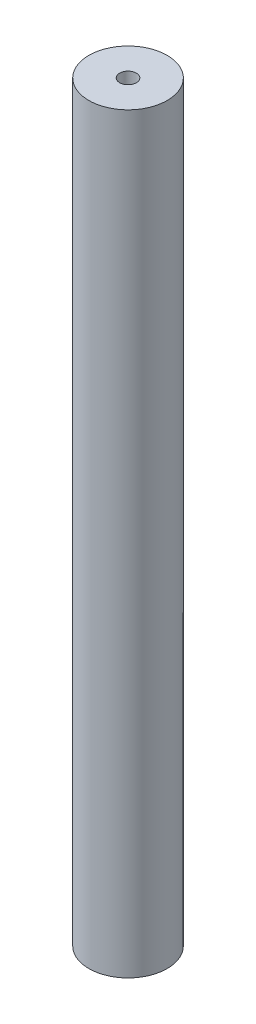
ISO-10303-21;
HEADER;
FILE_DESCRIPTION(('STEP AP214'),'2;1');
FILE_NAME('part.step','',(''),(''),'','','');
FILE_SCHEMA(('AUTOMOTIVE_DESIGN { 1 0 10303 214 1 1 1 1 }'));
ENDSEC;
DATA;
#1=APPLICATION_CONTEXT('core data for automotive mechanical design processes');
#2=APPLICATION_PROTOCOL_DEFINITION('international standard','automotive_design',2000,#1);
#3=PRODUCT_CONTEXT('',#1,'mechanical');
#4=PRODUCT('Part','Part','',(#3));
#5=PRODUCT_RELATED_PRODUCT_CATEGORY('part','',(#4));
#6=PRODUCT_DEFINITION_FORMATION('','',#4);
#7=PRODUCT_DEFINITION_CONTEXT('part definition',#1,'design');
#8=PRODUCT_DEFINITION('design','',#6,#7);
#9=PRODUCT_DEFINITION_SHAPE('','',#8);
#10=(LENGTH_UNIT() NAMED_UNIT(*) SI_UNIT(.MILLI.,.METRE.));
#11=(NAMED_UNIT(*) PLANE_ANGLE_UNIT() SI_UNIT($,.RADIAN.));
#12=(NAMED_UNIT(*) SI_UNIT($,.STERADIAN.) SOLID_ANGLE_UNIT());
#13=UNCERTAINTY_MEASURE_WITH_UNIT(LENGTH_MEASURE(1.E-05),#10,'distance_accuracy_value','');
#14=(GEOMETRIC_REPRESENTATION_CONTEXT(3) GLOBAL_UNCERTAINTY_ASSIGNED_CONTEXT((#13)) GLOBAL_UNIT_ASSIGNED_CONTEXT((#10,
#11,#12)) REPRESENTATION_CONTEXT('',''));
#15=CARTESIAN_POINT('',(0.,0.,0.));
#16=DIRECTION('',(0.,0.,1.));
#17=DIRECTION('',(1.,0.,0.));
#18=AXIS2_PLACEMENT_3D('',#15,#16,#17);
#19=CARTESIAN_POINT('',(0.,0.,0.));
#20=DIRECTION('',(0.,1.,0.));
#21=DIRECTION('',(0.,0.,1.));
#22=AXIS2_PLACEMENT_3D('',#19,#20,#21);
#23=PLANE('',#22);
#24=CARTESIAN_POINT('',(0.,0.,0.));
#25=DIRECTION('',(0.,-1.,0.));
#26=DIRECTION('',(0.,0.,-1.));
#27=AXIS2_PLACEMENT_3D('',#24,#25,#26);
#28=CIRCLE('',#27,2.54);
#29=CARTESIAN_POINT('',(0.,0.,-2.54));
#30=VERTEX_POINT('',#29);
#31=EDGE_CURVE('E10',#30,#30,#28,.T.);
#32=ORIENTED_EDGE('',*,*,#31,.F.);
#33=EDGE_LOOP('',(#32));
#34=FACE_BOUND('',#33,.T.);
#35=CARTESIAN_POINT('',(0.,0.,0.));
#36=DIRECTION('',(0.,-1.,0.));
#37=DIRECTION('',(0.,0.,-1.));
#38=AXIS2_PLACEMENT_3D('',#35,#36,#37);
#39=CIRCLE('',#38,6.35);
#40=CARTESIAN_POINT('',(0.,0.,-6.35));
#41=VERTEX_POINT('',#40);
#42=EDGE_CURVE('E64',#41,#41,#39,.T.);
#43=ORIENTED_EDGE('',*,*,#42,.T.);
#44=EDGE_LOOP('',(#43));
#45=FACE_BOUND('',#44,.T.);
#46=ADVANCED_FACE('F41',(#34,#45),#23,.F.);
#47=CARTESIAN_POINT('',(0.,0.,0.));
#48=DIRECTION('',(0.,-1.,0.));
#49=DIRECTION('',(0.,0.,-1.));
#50=AXIS2_PLACEMENT_3D('',#47,#48,#49);
#51=CYLINDRICAL_SURFACE('',#50,2.54);
#52=CARTESIAN_POINT('',(0.,222.25,0.));
#53=DIRECTION('',(0.,-1.,0.));
#54=DIRECTION('',(0.,0.,-1.));
#55=AXIS2_PLACEMENT_3D('',#52,#53,#54);
#56=CIRCLE('',#55,2.54);
#57=CARTESIAN_POINT('',(0.,222.25,-2.54));
#58=VERTEX_POINT('',#57);
#59=EDGE_CURVE('E48',#58,#58,#56,.T.);
#60=ORIENTED_EDGE('',*,*,#59,.F.);
#61=EDGE_LOOP('',(#60));
#62=FACE_BOUND('',#61,.T.);
#63=ORIENTED_EDGE('',*,*,#31,.T.);
#64=EDGE_LOOP('',(#63));
#65=FACE_BOUND('',#64,.T.);
#66=ADVANCED_FACE('F84',(#62,#65),#51,.F.);
#67=CARTESIAN_POINT('',(0.,222.25,0.));
#68=DIRECTION('',(0.,-1.,0.));
#69=DIRECTION('',(0.,0.,-1.));
#70=AXIS2_PLACEMENT_3D('',#67,#68,#69);
#71=PLANE('',#70);
#72=CARTESIAN_POINT('',(0.,222.25,0.));
#73=DIRECTION('',(0.,-1.,0.));
#74=DIRECTION('',(0.,0.,-1.));
#75=AXIS2_PLACEMENT_3D('',#72,#73,#74);
#76=CIRCLE('',#75,11.8999);
#77=CARTESIAN_POINT('',(0.,222.25,-11.8999));
#78=VERTEX_POINT('',#77);
#79=EDGE_CURVE('E53',#78,#78,#76,.T.);
#80=ORIENTED_EDGE('',*,*,#79,.F.);
#81=EDGE_LOOP('',(#80));
#82=FACE_BOUND('',#81,.T.);
#83=ORIENTED_EDGE('',*,*,#59,.T.);
#84=EDGE_LOOP('',(#83));
#85=FACE_BOUND('',#84,.T.);
#86=ADVANCED_FACE('F79',(#82,#85),#71,.F.);
#87=CARTESIAN_POINT('',(0.,0.,0.));
#88=DIRECTION('',(0.,-1.,0.));
#89=DIRECTION('',(0.,0.,-1.));
#90=AXIS2_PLACEMENT_3D('',#87,#88,#89);
#91=CYLINDRICAL_SURFACE('',#90,11.8999);
#92=CARTESIAN_POINT('',(0.,-6.35,0.));
#93=DIRECTION('',(0.,-1.,0.));
#94=DIRECTION('',(0.,0.,-1.));
#95=AXIS2_PLACEMENT_3D('',#92,#93,#94);
#96=CIRCLE('',#95,11.8999);
#97=CARTESIAN_POINT('',(0.,-6.35,-11.8999));
#98=VERTEX_POINT('',#97);
#99=EDGE_CURVE('E58',#98,#98,#96,.T.);
#100=ORIENTED_EDGE('',*,*,#99,.F.);
#101=EDGE_LOOP('',(#100));
#102=FACE_BOUND('',#101,.T.);
#103=ORIENTED_EDGE('',*,*,#79,.T.);
#104=EDGE_LOOP('',(#103));
#105=FACE_BOUND('',#104,.T.);
#106=ADVANCED_FACE('F73',(#102,#105),#91,.T.);
#107=CARTESIAN_POINT('',(0.,-6.35,0.));
#108=DIRECTION('',(0.,-1.,0.));
#109=DIRECTION('',(0.,0.,-1.));
#110=AXIS2_PLACEMENT_3D('',#107,#108,#109);
#111=CONICAL_SURFACE('',#110,11.8999,0.71826334718192);
#112=ORIENTED_EDGE('',*,*,#42,.F.);
#113=EDGE_LOOP('',(#112));
#114=FACE_BOUND('',#113,.T.);
#115=ORIENTED_EDGE('',*,*,#99,.T.);
#116=EDGE_LOOP('',(#115));
#117=FACE_BOUND('',#116,.T.);
#118=ADVANCED_FACE('F70',(#114,#117),#111,.F.);
#119=CLOSED_SHELL('',(#46,#66,#86,#106,#118));
#120=MANIFOLD_SOLID_BREP('B2',#119);
#121=ADVANCED_BREP_SHAPE_REPRESENTATION('',(#18,#120),#14);
#122=SHAPE_DEFINITION_REPRESENTATION(#9,#121);
ENDSEC;
END-ISO-10303-21;
